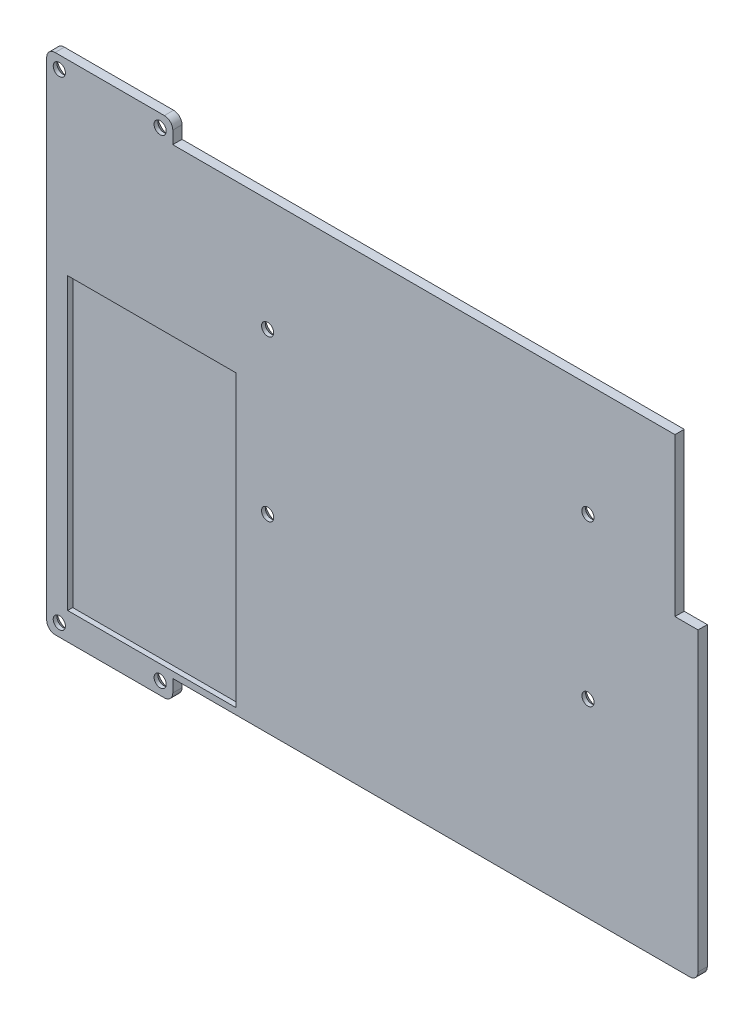
ISO-10303-21;
HEADER;
FILE_DESCRIPTION(('STEP AP214'),'2;1');
FILE_NAME('part.step','',(''),(''),'','','');
FILE_SCHEMA(('AUTOMOTIVE_DESIGN { 1 0 10303 214 1 1 1 1 }'));
ENDSEC;
DATA;
#1=APPLICATION_CONTEXT('core data for automotive mechanical design processes');
#2=APPLICATION_PROTOCOL_DEFINITION('international standard','automotive_design',2000,#1);
#3=PRODUCT_CONTEXT('',#1,'mechanical');
#4=PRODUCT('Part','Part','',(#3));
#5=PRODUCT_RELATED_PRODUCT_CATEGORY('part','',(#4));
#6=PRODUCT_DEFINITION_FORMATION('','',#4);
#7=PRODUCT_DEFINITION_CONTEXT('part definition',#1,'design');
#8=PRODUCT_DEFINITION('design','',#6,#7);
#9=PRODUCT_DEFINITION_SHAPE('','',#8);
#10=(LENGTH_UNIT() NAMED_UNIT(*) SI_UNIT(.MILLI.,.METRE.));
#11=(NAMED_UNIT(*) PLANE_ANGLE_UNIT() SI_UNIT($,.RADIAN.));
#12=(NAMED_UNIT(*) SI_UNIT($,.STERADIAN.) SOLID_ANGLE_UNIT());
#13=UNCERTAINTY_MEASURE_WITH_UNIT(LENGTH_MEASURE(1.E-05),#10,'distance_accuracy_value','');
#14=(GEOMETRIC_REPRESENTATION_CONTEXT(3) GLOBAL_UNCERTAINTY_ASSIGNED_CONTEXT((#13)) GLOBAL_UNIT_ASSIGNED_CONTEXT((#10,
#11,#12)) REPRESENTATION_CONTEXT('',''));
#15=CARTESIAN_POINT('',(0.,0.,0.));
#16=DIRECTION('',(0.,0.,1.));
#17=DIRECTION('',(1.,0.,0.));
#18=AXIS2_PLACEMENT_3D('',#15,#16,#17);
#19=CARTESIAN_POINT('',(153.,-53.,2.2));
#20=DIRECTION('',(0.,0.,1.));
#21=DIRECTION('',(1.,0.,0.));
#22=AXIS2_PLACEMENT_3D('',#19,#20,#21);
#23=PLANE('',#22);
#24=CARTESIAN_POINT('',(27.,57.,2.19999999999999));
#25=DIRECTION('',(0.,0.,-1.));
#26=DIRECTION('',(-1.,0.,0.));
#27=AXIS2_PLACEMENT_3D('',#24,#25,#26);
#28=CIRCLE('',#27,1.44999999999999);
#29=CARTESIAN_POINT('',(25.55,57.,2.19999999999999));
#30=VERTEX_POINT('',#29);
#31=EDGE_CURVE('E296',#30,#30,#28,.T.);
#32=ORIENTED_EDGE('',*,*,#31,.T.);
#33=EDGE_LOOP('',(#32));
#34=FACE_BOUND('',#33,.T.);
#35=CARTESIAN_POINT('',(3.00000000000002,57.,2.19999999999999));
#36=DIRECTION('',(0.,0.,-1.));
#37=DIRECTION('',(-1.,0.,0.));
#38=AXIS2_PLACEMENT_3D('',#35,#36,#37);
#39=CIRCLE('',#38,1.44999999999999);
#40=CARTESIAN_POINT('',(1.55000000000003,57.,2.19999999999999));
#41=VERTEX_POINT('',#40);
#42=EDGE_CURVE('E305',#41,#41,#39,.T.);
#43=ORIENTED_EDGE('',*,*,#42,.T.);
#44=EDGE_LOOP('',(#43));
#45=FACE_BOUND('',#44,.T.);
#46=CARTESIAN_POINT('',(27.,-57.,2.19999999999999));
#47=DIRECTION('',(0.,0.,-1.));
#48=DIRECTION('',(-1.,0.,0.));
#49=AXIS2_PLACEMENT_3D('',#46,#47,#48);
#50=CIRCLE('',#49,1.44999999999999);
#51=CARTESIAN_POINT('',(25.55,-57.,2.19999999999999));
#52=VERTEX_POINT('',#51);
#53=EDGE_CURVE('E314',#52,#52,#50,.T.);
#54=ORIENTED_EDGE('',*,*,#53,.T.);
#55=EDGE_LOOP('',(#54));
#56=FACE_BOUND('',#55,.T.);
#57=CARTESIAN_POINT('',(3.00000000000002,-57.,2.19999999999999));
#58=DIRECTION('',(0.,0.,-1.));
#59=DIRECTION('',(-1.,0.,0.));
#60=AXIS2_PLACEMENT_3D('',#57,#58,#59);
#61=CIRCLE('',#60,1.44999999999999);
#62=CARTESIAN_POINT('',(1.55000000000003,-57.,2.19999999999999));
#63=VERTEX_POINT('',#62);
#64=EDGE_CURVE('E323',#63,#63,#61,.T.);
#65=ORIENTED_EDGE('',*,*,#64,.T.);
#66=EDGE_LOOP('',(#65));
#67=FACE_BOUND('',#66,.T.);
#68=CARTESIAN_POINT('',(52.575,28.25,2.19999999999999));
#69=DIRECTION('',(0.,0.,-1.));
#70=DIRECTION('',(-1.,0.,0.));
#71=AXIS2_PLACEMENT_3D('',#68,#69,#70);
#72=CIRCLE('',#71,1.44999999999999);
#73=CARTESIAN_POINT('',(51.125,28.25,2.19999999999999));
#74=VERTEX_POINT('',#73);
#75=EDGE_CURVE('E332',#74,#74,#72,.T.);
#76=ORIENTED_EDGE('',*,*,#75,.T.);
#77=EDGE_LOOP('',(#76));
#78=FACE_BOUND('',#77,.T.);
#79=CARTESIAN_POINT('',(128.8,28.25,2.19999999999999));
#80=DIRECTION('',(0.,0.,-1.));
#81=DIRECTION('',(-1.,0.,0.));
#82=AXIS2_PLACEMENT_3D('',#79,#80,#81);
#83=CIRCLE('',#82,1.44999999999998);
#84=CARTESIAN_POINT('',(127.35,28.25,2.19999999999999));
#85=VERTEX_POINT('',#84);
#86=EDGE_CURVE('E341',#85,#85,#83,.T.);
#87=ORIENTED_EDGE('',*,*,#86,.T.);
#88=EDGE_LOOP('',(#87));
#89=FACE_BOUND('',#88,.T.);
#90=CARTESIAN_POINT('',(128.8,-9.84999999999998,2.19999999999999));
#91=DIRECTION('',(0.,0.,-1.));
#92=DIRECTION('',(-1.,0.,0.));
#93=AXIS2_PLACEMENT_3D('',#90,#91,#92);
#94=CIRCLE('',#93,1.44999999999998);
#95=CARTESIAN_POINT('',(127.35,-9.84999999999998,2.19999999999999));
#96=VERTEX_POINT('',#95);
#97=EDGE_CURVE('E350',#96,#96,#94,.T.);
#98=ORIENTED_EDGE('',*,*,#97,.T.);
#99=EDGE_LOOP('',(#98));
#100=FACE_BOUND('',#99,.T.);
#101=CARTESIAN_POINT('',(52.575,-9.84999999999998,2.19999999999999));
#102=DIRECTION('',(0.,0.,-1.));
#103=DIRECTION('',(-1.,0.,0.));
#104=AXIS2_PLACEMENT_3D('',#101,#102,#103);
#105=CIRCLE('',#104,1.44999999999999);
#106=CARTESIAN_POINT('',(51.125,-9.84999999999998,2.19999999999999));
#107=VERTEX_POINT('',#106);
#108=EDGE_CURVE('E196',#107,#107,#105,.T.);
#109=ORIENTED_EDGE('',*,*,#108,.T.);
#110=EDGE_LOOP('',(#109));
#111=FACE_BOUND('',#110,.T.);
#112=CARTESIAN_POINT('',(153.,-53.,2.2));
#113=DIRECTION('',(0.,0.,1.));
#114=DIRECTION('',(1.,0.,0.));
#115=AXIS2_PLACEMENT_3D('',#112,#113,#114);
#116=CIRCLE('',#115,1.99999999999999);
#117=CARTESIAN_POINT('',(153.,-55.,2.2));
#118=VERTEX_POINT('',#117);
#119=CARTESIAN_POINT('',(155.,-53.,2.2));
#120=VERTEX_POINT('',#119);
#121=EDGE_CURVE('E222',#118,#120,#116,.T.);
#122=ORIENTED_EDGE('',*,*,#121,.T.);
#123=DIRECTION('',(0.,1.,0.));
#124=VECTOR('',#123,1.);
#125=CARTESIAN_POINT('',(155.,-53.,2.2));
#126=LINE('',#125,#124);
#127=CARTESIAN_POINT('',(155.,17.5,2.2));
#128=VERTEX_POINT('',#127);
#129=EDGE_CURVE('E128',#120,#128,#126,.T.);
#130=ORIENTED_EDGE('',*,*,#129,.T.);
#131=DIRECTION('',(-1.,0.,0.));
#132=VECTOR('',#131,1.);
#133=CARTESIAN_POINT('',(149.5,17.5,2.2));
#134=LINE('',#133,#132);
#135=CARTESIAN_POINT('',(149.5,17.5,2.2));
#136=VERTEX_POINT('',#135);
#137=EDGE_CURVE('E363',#128,#136,#134,.T.);
#138=ORIENTED_EDGE('',*,*,#137,.T.);
#139=DIRECTION('',(0.,1.,0.));
#140=VECTOR('',#139,1.);
#141=CARTESIAN_POINT('',(149.5,55.,2.2));
#142=LINE('',#141,#140);
#143=CARTESIAN_POINT('',(149.5,55.,2.2));
#144=VERTEX_POINT('',#143);
#145=EDGE_CURVE('E365',#136,#144,#142,.T.);
#146=ORIENTED_EDGE('',*,*,#145,.T.);
#147=DIRECTION('',(-1.,0.,0.));
#148=VECTOR('',#147,1.);
#149=CARTESIAN_POINT('',(149.5,55.,2.2));
#150=LINE('',#149,#148);
#151=CARTESIAN_POINT('',(30.,55.,2.2));
#152=VERTEX_POINT('',#151);
#153=EDGE_CURVE('E367',#144,#152,#150,.T.);
#154=ORIENTED_EDGE('',*,*,#153,.T.);
#155=DIRECTION('',(0.,1.,0.));
#156=VECTOR('',#155,1.);
#157=CARTESIAN_POINT('',(30.,55.,2.2));
#158=LINE('',#157,#156);
#159=CARTESIAN_POINT('',(30.,58.,2.2));
#160=VERTEX_POINT('',#159);
#161=EDGE_CURVE('E369',#152,#160,#158,.T.);
#162=ORIENTED_EDGE('',*,*,#161,.T.);
#163=CARTESIAN_POINT('',(28.,58.,2.2));
#164=DIRECTION('',(0.,0.,1.));
#165=DIRECTION('',(-1.,0.,0.));
#166=AXIS2_PLACEMENT_3D('',#163,#164,#165);
#167=CIRCLE('',#166,2.);
#168=CARTESIAN_POINT('',(28.,60.,2.2));
#169=VERTEX_POINT('',#168);
#170=EDGE_CURVE('E371',#160,#169,#167,.T.);
#171=ORIENTED_EDGE('',*,*,#170,.T.);
#172=DIRECTION('',(-1.,0.,0.));
#173=VECTOR('',#172,1.);
#174=CARTESIAN_POINT('',(2.,60.,2.2));
#175=LINE('',#174,#173);
#176=CARTESIAN_POINT('',(2.,60.,2.2));
#177=VERTEX_POINT('',#176);
#178=EDGE_CURVE('E373',#169,#177,#175,.T.);
#179=ORIENTED_EDGE('',*,*,#178,.T.);
#180=CARTESIAN_POINT('',(2.,58.,2.2));
#181=DIRECTION('',(0.,0.,1.));
#182=DIRECTION('',(-1.,0.,0.));
#183=AXIS2_PLACEMENT_3D('',#180,#181,#182);
#184=CIRCLE('',#183,1.99999999999999);
#185=CARTESIAN_POINT('',(0.,58.,2.2));
#186=VERTEX_POINT('',#185);
#187=EDGE_CURVE('E375',#177,#186,#184,.T.);
#188=ORIENTED_EDGE('',*,*,#187,.T.);
#189=DIRECTION('',(0.,-1.,0.));
#190=VECTOR('',#189,1.);
#191=CARTESIAN_POINT('',(0.,-58.,2.2));
#192=LINE('',#191,#190);
#193=CARTESIAN_POINT('',(0.,-58.,2.2));
#194=VERTEX_POINT('',#193);
#195=EDGE_CURVE('E377',#186,#194,#192,.T.);
#196=ORIENTED_EDGE('',*,*,#195,.T.);
#197=CARTESIAN_POINT('',(2.,-58.,2.2));
#198=DIRECTION('',(0.,0.,1.));
#199=DIRECTION('',(-1.,0.,0.));
#200=AXIS2_PLACEMENT_3D('',#197,#198,#199);
#201=CIRCLE('',#200,2.);
#202=CARTESIAN_POINT('',(2.,-60.,2.2));
#203=VERTEX_POINT('',#202);
#204=EDGE_CURVE('E379',#194,#203,#201,.T.);
#205=ORIENTED_EDGE('',*,*,#204,.T.);
#206=DIRECTION('',(1.,0.,0.));
#207=VECTOR('',#206,1.);
#208=CARTESIAN_POINT('',(2.,-60.,2.2));
#209=LINE('',#208,#207);
#210=CARTESIAN_POINT('',(28.,-60.,2.2));
#211=VERTEX_POINT('',#210);
#212=EDGE_CURVE('E171',#203,#211,#209,.T.);
#213=ORIENTED_EDGE('',*,*,#212,.T.);
#214=CARTESIAN_POINT('',(28.,-58.,2.2));
#215=DIRECTION('',(0.,0.,1.));
#216=DIRECTION('',(1.,0.,0.));
#217=AXIS2_PLACEMENT_3D('',#214,#215,#216);
#218=CIRCLE('',#217,2.);
#219=CARTESIAN_POINT('',(30.,-58.,2.2));
#220=VERTEX_POINT('',#219);
#221=EDGE_CURVE('E164',#211,#220,#218,.T.);
#222=ORIENTED_EDGE('',*,*,#221,.T.);
#223=DIRECTION('',(0.,1.,0.));
#224=VECTOR('',#223,1.);
#225=CARTESIAN_POINT('',(30.,-55.,2.2));
#226=LINE('',#225,#224);
#227=CARTESIAN_POINT('',(30.,-55.,2.2));
#228=VERTEX_POINT('',#227);
#229=EDGE_CURVE('E168',#220,#228,#226,.T.);
#230=ORIENTED_EDGE('',*,*,#229,.T.);
#231=DIRECTION('',(1.,0.,0.));
#232=VECTOR('',#231,1.);
#233=CARTESIAN_POINT('',(153.,-55.,2.2));
#234=LINE('',#233,#232);
#235=EDGE_CURVE('E65',#228,#118,#234,.T.);
#236=ORIENTED_EDGE('',*,*,#235,.T.);
#237=EDGE_LOOP('',(#122,#130,#138,#146,#154,#162,#171,#179,#188,#196,#205,#213,#222,#230,#236));
#238=FACE_BOUND('',#237,.T.);
#239=DIRECTION('',(-1.,0.,0.));
#240=VECTOR('',#239,1.);
#241=CARTESIAN_POINT('',(153.,-53.5,2.2));
#242=LINE('',#241,#240);
#243=CARTESIAN_POINT('',(45.,-53.5,2.2));
#244=VERTEX_POINT('',#243);
#245=CARTESIAN_POINT('',(5.00000000000002,-53.5,2.2));
#246=VERTEX_POINT('',#245);
#247=EDGE_CURVE('E49',#244,#246,#242,.T.);
#248=ORIENTED_EDGE('',*,*,#247,.T.);
#249=DIRECTION('',(0.,1.,0.));
#250=VECTOR('',#249,1.);
#251=CARTESIAN_POINT('',(5.,-53.,2.2));
#252=LINE('',#251,#250);
#253=CARTESIAN_POINT('',(5.00000000000001,15.5,2.2));
#254=VERTEX_POINT('',#253);
#255=EDGE_CURVE('E11',#246,#254,#252,.T.);
#256=ORIENTED_EDGE('',*,*,#255,.T.);
#257=DIRECTION('',(1.,0.,0.));
#258=VECTOR('',#257,1.);
#259=CARTESIAN_POINT('',(153.,15.5,2.2));
#260=LINE('',#259,#258);
#261=CARTESIAN_POINT('',(45.,15.5,2.2));
#262=VERTEX_POINT('',#261);
#263=EDGE_CURVE('E258',#254,#262,#260,.T.);
#264=ORIENTED_EDGE('',*,*,#263,.T.);
#265=DIRECTION('',(0.,-1.,0.));
#266=VECTOR('',#265,1.);
#267=CARTESIAN_POINT('',(45.,-53.,2.2));
#268=LINE('',#267,#266);
#269=EDGE_CURVE('E261',#262,#244,#268,.T.);
#270=ORIENTED_EDGE('',*,*,#269,.T.);
#271=EDGE_LOOP('',(#248,#256,#264,#270));
#272=FACE_BOUND('',#271,.T.);
#273=ADVANCED_FACE('F41',(#34,#45,#56,#67,#78,#89,#100,#111,#238,#272),#23,.T.);
#274=CARTESIAN_POINT('',(153.,-53.,0.));
#275=DIRECTION('',(0.,0.,1.));
#276=DIRECTION('',(1.,0.,0.));
#277=AXIS2_PLACEMENT_3D('',#274,#275,#276);
#278=PLANE('',#277);
#279=CARTESIAN_POINT('',(27.,57.,0.));
#280=DIRECTION('',(0.,0.,-1.));
#281=DIRECTION('',(-1.,0.,0.));
#282=AXIS2_PLACEMENT_3D('',#279,#280,#281);
#283=CIRCLE('',#282,2.75);
#284=CARTESIAN_POINT('',(24.25,57.,0.));
#285=VERTEX_POINT('',#284);
#286=EDGE_CURVE('E285',#285,#285,#283,.T.);
#287=ORIENTED_EDGE('',*,*,#286,.F.);
#288=EDGE_LOOP('',(#287));
#289=FACE_BOUND('',#288,.T.);
#290=CARTESIAN_POINT('',(3.00000000000002,57.,0.));
#291=DIRECTION('',(0.,0.,-1.));
#292=DIRECTION('',(-1.,0.,0.));
#293=AXIS2_PLACEMENT_3D('',#290,#291,#292);
#294=CIRCLE('',#293,2.75);
#295=CARTESIAN_POINT('',(0.250000000000018,57.,0.));
#296=VERTEX_POINT('',#295);
#297=EDGE_CURVE('E299',#296,#296,#294,.T.);
#298=ORIENTED_EDGE('',*,*,#297,.F.);
#299=EDGE_LOOP('',(#298));
#300=FACE_BOUND('',#299,.T.);
#301=CARTESIAN_POINT('',(3.00000000000002,-57.,0.));
#302=DIRECTION('',(0.,0.,-1.));
#303=DIRECTION('',(-1.,0.,0.));
#304=AXIS2_PLACEMENT_3D('',#301,#302,#303);
#305=CIRCLE('',#304,2.75);
#306=CARTESIAN_POINT('',(0.250000000000018,-57.,0.));
#307=VERTEX_POINT('',#306);
#308=EDGE_CURVE('E317',#307,#307,#305,.T.);
#309=ORIENTED_EDGE('',*,*,#308,.F.);
#310=EDGE_LOOP('',(#309));
#311=FACE_BOUND('',#310,.T.);
#312=CARTESIAN_POINT('',(52.575,28.25,0.));
#313=DIRECTION('',(0.,0.,-1.));
#314=DIRECTION('',(-1.,0.,0.));
#315=AXIS2_PLACEMENT_3D('',#312,#313,#314);
#316=CIRCLE('',#315,2.75);
#317=CARTESIAN_POINT('',(49.825,28.25,0.));
#318=VERTEX_POINT('',#317);
#319=EDGE_CURVE('E326',#318,#318,#316,.T.);
#320=ORIENTED_EDGE('',*,*,#319,.F.);
#321=EDGE_LOOP('',(#320));
#322=FACE_BOUND('',#321,.T.);
#323=CARTESIAN_POINT('',(128.8,28.25,0.));
#324=DIRECTION('',(0.,0.,-1.));
#325=DIRECTION('',(-1.,0.,0.));
#326=AXIS2_PLACEMENT_3D('',#323,#324,#325);
#327=CIRCLE('',#326,2.75);
#328=CARTESIAN_POINT('',(126.05,28.25,0.));
#329=VERTEX_POINT('',#328);
#330=EDGE_CURVE('E335',#329,#329,#327,.T.);
#331=ORIENTED_EDGE('',*,*,#330,.F.);
#332=EDGE_LOOP('',(#331));
#333=FACE_BOUND('',#332,.T.);
#334=CARTESIAN_POINT('',(128.8,-9.84999999999998,0.));
#335=DIRECTION('',(0.,0.,-1.));
#336=DIRECTION('',(-1.,0.,0.));
#337=AXIS2_PLACEMENT_3D('',#334,#335,#336);
#338=CIRCLE('',#337,2.75);
#339=CARTESIAN_POINT('',(126.05,-9.84999999999998,0.));
#340=VERTEX_POINT('',#339);
#341=EDGE_CURVE('E344',#340,#340,#338,.T.);
#342=ORIENTED_EDGE('',*,*,#341,.F.);
#343=EDGE_LOOP('',(#342));
#344=FACE_BOUND('',#343,.T.);
#345=CARTESIAN_POINT('',(52.575,-9.84999999999998,0.));
#346=DIRECTION('',(0.,0.,-1.));
#347=DIRECTION('',(-1.,0.,0.));
#348=AXIS2_PLACEMENT_3D('',#345,#346,#347);
#349=CIRCLE('',#348,2.75);
#350=CARTESIAN_POINT('',(49.825,-9.84999999999998,0.));
#351=VERTEX_POINT('',#350);
#352=EDGE_CURVE('E353',#351,#351,#349,.T.);
#353=ORIENTED_EDGE('',*,*,#352,.F.);
#354=EDGE_LOOP('',(#353));
#355=FACE_BOUND('',#354,.T.);
#356=CARTESIAN_POINT('',(153.,-53.,0.));
#357=DIRECTION('',(0.,0.,1.));
#358=DIRECTION('',(1.,0.,0.));
#359=AXIS2_PLACEMENT_3D('',#356,#357,#358);
#360=CIRCLE('',#359,1.99999999999999);
#361=CARTESIAN_POINT('',(153.,-55.,0.));
#362=VERTEX_POINT('',#361);
#363=CARTESIAN_POINT('',(155.,-53.,0.));
#364=VERTEX_POINT('',#363);
#365=EDGE_CURVE('E192',#362,#364,#360,.T.);
#366=ORIENTED_EDGE('',*,*,#365,.F.);
#367=DIRECTION('',(1.,0.,0.));
#368=VECTOR('',#367,1.);
#369=CARTESIAN_POINT('',(153.,-55.,0.));
#370=LINE('',#369,#368);
#371=CARTESIAN_POINT('',(30.,-55.,0.));
#372=VERTEX_POINT('',#371);
#373=EDGE_CURVE('E119',#372,#362,#370,.T.);
#374=ORIENTED_EDGE('',*,*,#373,.F.);
#375=DIRECTION('',(0.,1.,0.));
#376=VECTOR('',#375,1.);
#377=CARTESIAN_POINT('',(30.,-55.,0.));
#378=LINE('',#377,#376);
#379=CARTESIAN_POINT('',(30.,-58.,0.));
#380=VERTEX_POINT('',#379);
#381=EDGE_CURVE('E219',#380,#372,#378,.T.);
#382=ORIENTED_EDGE('',*,*,#381,.F.);
#383=CARTESIAN_POINT('',(28.,-58.,0.));
#384=DIRECTION('',(0.,0.,1.));
#385=DIRECTION('',(1.,0.,0.));
#386=AXIS2_PLACEMENT_3D('',#383,#384,#385);
#387=CIRCLE('',#386,2.);
#388=CARTESIAN_POINT('',(28.,-60.,0.));
#389=VERTEX_POINT('',#388);
#390=EDGE_CURVE('E180',#389,#380,#387,.T.);
#391=ORIENTED_EDGE('',*,*,#390,.F.);
#392=DIRECTION('',(1.,0.,0.));
#393=VECTOR('',#392,1.);
#394=CARTESIAN_POINT('',(2.,-60.,0.));
#395=LINE('',#394,#393);
#396=CARTESIAN_POINT('',(2.,-60.,0.));
#397=VERTEX_POINT('',#396);
#398=EDGE_CURVE('E216',#397,#389,#395,.T.);
#399=ORIENTED_EDGE('',*,*,#398,.F.);
#400=CARTESIAN_POINT('',(2.,-58.,0.));
#401=DIRECTION('',(0.,0.,1.));
#402=DIRECTION('',(-1.,0.,0.));
#403=AXIS2_PLACEMENT_3D('',#400,#401,#402);
#404=CIRCLE('',#403,2.);
#405=CARTESIAN_POINT('',(0.,-58.,0.));
#406=VERTEX_POINT('',#405);
#407=EDGE_CURVE('E214',#406,#397,#404,.T.);
#408=ORIENTED_EDGE('',*,*,#407,.F.);
#409=DIRECTION('',(0.,-1.,0.));
#410=VECTOR('',#409,1.);
#411=CARTESIAN_POINT('',(0.,-58.,0.));
#412=LINE('',#411,#410);
#413=CARTESIAN_POINT('',(0.,58.,0.));
#414=VERTEX_POINT('',#413);
#415=EDGE_CURVE('E212',#414,#406,#412,.T.);
#416=ORIENTED_EDGE('',*,*,#415,.F.);
#417=CARTESIAN_POINT('',(2.,58.,0.));
#418=DIRECTION('',(0.,0.,1.));
#419=DIRECTION('',(-1.,0.,0.));
#420=AXIS2_PLACEMENT_3D('',#417,#418,#419);
#421=CIRCLE('',#420,1.99999999999999);
#422=CARTESIAN_POINT('',(2.,60.,0.));
#423=VERTEX_POINT('',#422);
#424=EDGE_CURVE('E210',#423,#414,#421,.T.);
#425=ORIENTED_EDGE('',*,*,#424,.F.);
#426=DIRECTION('',(-1.,0.,0.));
#427=VECTOR('',#426,1.);
#428=CARTESIAN_POINT('',(2.,60.,0.));
#429=LINE('',#428,#427);
#430=CARTESIAN_POINT('',(28.,60.,0.));
#431=VERTEX_POINT('',#430);
#432=EDGE_CURVE('E208',#431,#423,#429,.T.);
#433=ORIENTED_EDGE('',*,*,#432,.F.);
#434=CARTESIAN_POINT('',(28.,58.,0.));
#435=DIRECTION('',(0.,0.,1.));
#436=DIRECTION('',(-1.,0.,0.));
#437=AXIS2_PLACEMENT_3D('',#434,#435,#436);
#438=CIRCLE('',#437,2.);
#439=CARTESIAN_POINT('',(30.,58.,0.));
#440=VERTEX_POINT('',#439);
#441=EDGE_CURVE('E206',#440,#431,#438,.T.);
#442=ORIENTED_EDGE('',*,*,#441,.F.);
#443=DIRECTION('',(0.,1.,0.));
#444=VECTOR('',#443,1.);
#445=CARTESIAN_POINT('',(30.,55.,0.));
#446=LINE('',#445,#444);
#447=CARTESIAN_POINT('',(30.,55.,0.));
#448=VERTEX_POINT('',#447);
#449=EDGE_CURVE('E204',#448,#440,#446,.T.);
#450=ORIENTED_EDGE('',*,*,#449,.F.);
#451=DIRECTION('',(-1.,0.,0.));
#452=VECTOR('',#451,1.);
#453=CARTESIAN_POINT('',(149.5,55.,0.));
#454=LINE('',#453,#452);
#455=CARTESIAN_POINT('',(149.5,55.,0.));
#456=VERTEX_POINT('',#455);
#457=EDGE_CURVE('E202',#456,#448,#454,.T.);
#458=ORIENTED_EDGE('',*,*,#457,.F.);
#459=DIRECTION('',(0.,1.,0.));
#460=VECTOR('',#459,1.);
#461=CARTESIAN_POINT('',(149.5,55.,0.));
#462=LINE('',#461,#460);
#463=CARTESIAN_POINT('',(149.5,17.5,0.));
#464=VERTEX_POINT('',#463);
#465=EDGE_CURVE('E200',#464,#456,#462,.T.);
#466=ORIENTED_EDGE('',*,*,#465,.F.);
#467=DIRECTION('',(-1.,0.,0.));
#468=VECTOR('',#467,1.);
#469=CARTESIAN_POINT('',(149.5,17.5,0.));
#470=LINE('',#469,#468);
#471=CARTESIAN_POINT('',(155.,17.5,0.));
#472=VERTEX_POINT('',#471);
#473=EDGE_CURVE('E198',#472,#464,#470,.T.);
#474=ORIENTED_EDGE('',*,*,#473,.F.);
#475=DIRECTION('',(0.,1.,0.));
#476=VECTOR('',#475,1.);
#477=CARTESIAN_POINT('',(155.,-53.,0.));
#478=LINE('',#477,#476);
#479=EDGE_CURVE('E195',#364,#472,#478,.T.);
#480=ORIENTED_EDGE('',*,*,#479,.F.);
#481=EDGE_LOOP('',(#366,#374,#382,#391,#399,#408,#416,#425,#433,#442,#450,#458,#466,#474,#480));
#482=FACE_BOUND('',#481,.T.);
#483=CARTESIAN_POINT('',(27.,-57.,0.));
#484=DIRECTION('',(0.,0.,-1.));
#485=DIRECTION('',(-1.,0.,0.));
#486=AXIS2_PLACEMENT_3D('',#483,#484,#485);
#487=CIRCLE('',#486,2.75);
#488=CARTESIAN_POINT('',(24.25,-57.,0.));
#489=VERTEX_POINT('',#488);
#490=EDGE_CURVE('E308',#489,#489,#487,.T.);
#491=ORIENTED_EDGE('',*,*,#490,.F.);
#492=EDGE_LOOP('',(#491));
#493=FACE_BOUND('',#492,.T.);
#494=ADVANCED_FACE('F392',(#289,#300,#311,#322,#333,#344,#355,#482,#493),#278,.F.);
#495=CARTESIAN_POINT('',(153.,-53.,2.2));
#496=DIRECTION('',(0.,0.,-1.));
#497=DIRECTION('',(-1.,0.,0.));
#498=AXIS2_PLACEMENT_3D('',#495,#496,#497);
#499=CYLINDRICAL_SURFACE('',#498,1.99999999999999);
#500=ORIENTED_EDGE('',*,*,#365,.T.);
#501=DIRECTION('',(0.,0.,-1.));
#502=VECTOR('',#501,1.);
#503=CARTESIAN_POINT('',(155.,-53.,2.2));
#504=LINE('',#503,#502);
#505=EDGE_CURVE('E256',#120,#364,#504,.T.);
#506=ORIENTED_EDGE('',*,*,#505,.F.);
#507=ORIENTED_EDGE('',*,*,#121,.F.);
#508=DIRECTION('',(0.,0.,-1.));
#509=VECTOR('',#508,1.);
#510=CARTESIAN_POINT('',(153.,-55.,2.2));
#511=LINE('',#510,#509);
#512=EDGE_CURVE('E188',#118,#362,#511,.T.);
#513=ORIENTED_EDGE('',*,*,#512,.T.);
#514=EDGE_LOOP('',(#500,#506,#507,#513));
#515=FACE_BOUND('',#514,.T.);
#516=ADVANCED_FACE('F43',(#515),#499,.T.);
#517=CARTESIAN_POINT('',(155.,-53.,2.2));
#518=DIRECTION('',(-1.,0.,0.));
#519=DIRECTION('',(0.,-1.,0.));
#520=AXIS2_PLACEMENT_3D('',#517,#518,#519);
#521=PLANE('',#520);
#522=ORIENTED_EDGE('',*,*,#479,.T.);
#523=DIRECTION('',(0.,0.,-1.));
#524=VECTOR('',#523,1.);
#525=CARTESIAN_POINT('',(155.,17.5,2.2));
#526=LINE('',#525,#524);
#527=EDGE_CURVE('E253',#128,#472,#526,.T.);
#528=ORIENTED_EDGE('',*,*,#527,.F.);
#529=ORIENTED_EDGE('',*,*,#129,.F.);
#530=ORIENTED_EDGE('',*,*,#505,.T.);
#531=EDGE_LOOP('',(#522,#528,#529,#530));
#532=FACE_BOUND('',#531,.T.);
#533=ADVANCED_FACE('F400',(#532),#521,.F.);
#534=CARTESIAN_POINT('',(149.5,17.5,2.2));
#535=DIRECTION('',(0.,-1.,0.));
#536=DIRECTION('',(0.,0.,-1.));
#537=AXIS2_PLACEMENT_3D('',#534,#535,#536);
#538=PLANE('',#537);
#539=ORIENTED_EDGE('',*,*,#473,.T.);
#540=DIRECTION('',(0.,0.,-1.));
#541=VECTOR('',#540,1.);
#542=CARTESIAN_POINT('',(149.5,17.5,2.2));
#543=LINE('',#542,#541);
#544=EDGE_CURVE('E250',#136,#464,#543,.T.);
#545=ORIENTED_EDGE('',*,*,#544,.F.);
#546=ORIENTED_EDGE('',*,*,#137,.F.);
#547=ORIENTED_EDGE('',*,*,#527,.T.);
#548=EDGE_LOOP('',(#539,#545,#546,#547));
#549=FACE_BOUND('',#548,.T.);
#550=ADVANCED_FACE('F403',(#549),#538,.F.);
#551=CARTESIAN_POINT('',(149.5,55.,2.2));
#552=DIRECTION('',(-1.,0.,0.));
#553=DIRECTION('',(0.,0.,1.));
#554=AXIS2_PLACEMENT_3D('',#551,#552,#553);
#555=PLANE('',#554);
#556=ORIENTED_EDGE('',*,*,#465,.T.);
#557=DIRECTION('',(0.,0.,-1.));
#558=VECTOR('',#557,1.);
#559=CARTESIAN_POINT('',(149.5,55.,2.2));
#560=LINE('',#559,#558);
#561=EDGE_CURVE('E247',#144,#456,#560,.T.);
#562=ORIENTED_EDGE('',*,*,#561,.F.);
#563=ORIENTED_EDGE('',*,*,#145,.F.);
#564=ORIENTED_EDGE('',*,*,#544,.T.);
#565=EDGE_LOOP('',(#556,#562,#563,#564));
#566=FACE_BOUND('',#565,.T.);
#567=ADVANCED_FACE('F408',(#566),#555,.F.);
#568=CARTESIAN_POINT('',(149.5,55.,2.2));
#569=DIRECTION('',(0.,-1.,0.));
#570=DIRECTION('',(1.,0.,0.));
#571=AXIS2_PLACEMENT_3D('',#568,#569,#570);
#572=PLANE('',#571);
#573=ORIENTED_EDGE('',*,*,#457,.T.);
#574=DIRECTION('',(0.,0.,-1.));
#575=VECTOR('',#574,1.);
#576=CARTESIAN_POINT('',(30.,55.,2.2));
#577=LINE('',#576,#575);
#578=EDGE_CURVE('E244',#152,#448,#577,.T.);
#579=ORIENTED_EDGE('',*,*,#578,.F.);
#580=ORIENTED_EDGE('',*,*,#153,.F.);
#581=ORIENTED_EDGE('',*,*,#561,.T.);
#582=EDGE_LOOP('',(#573,#579,#580,#581));
#583=FACE_BOUND('',#582,.T.);
#584=ADVANCED_FACE('F414',(#583),#572,.F.);
#585=CARTESIAN_POINT('',(30.,55.,2.2));
#586=DIRECTION('',(-1.,0.,0.));
#587=DIRECTION('',(0.,0.,1.));
#588=AXIS2_PLACEMENT_3D('',#585,#586,#587);
#589=PLANE('',#588);
#590=ORIENTED_EDGE('',*,*,#449,.T.);
#591=DIRECTION('',(0.,0.,-1.));
#592=VECTOR('',#591,1.);
#593=CARTESIAN_POINT('',(30.,58.,2.2));
#594=LINE('',#593,#592);
#595=EDGE_CURVE('E241',#160,#440,#594,.T.);
#596=ORIENTED_EDGE('',*,*,#595,.F.);
#597=ORIENTED_EDGE('',*,*,#161,.F.);
#598=ORIENTED_EDGE('',*,*,#578,.T.);
#599=EDGE_LOOP('',(#590,#596,#597,#598));
#600=FACE_BOUND('',#599,.T.);
#601=ADVANCED_FACE('F418',(#600),#589,.F.);
#602=CARTESIAN_POINT('',(28.,58.,2.2));
#603=DIRECTION('',(0.,0.,-1.));
#604=DIRECTION('',(-1.,0.,0.));
#605=AXIS2_PLACEMENT_3D('',#602,#603,#604);
#606=CYLINDRICAL_SURFACE('',#605,2.);
#607=ORIENTED_EDGE('',*,*,#441,.T.);
#608=DIRECTION('',(0.,0.,-1.));
#609=VECTOR('',#608,1.);
#610=CARTESIAN_POINT('',(28.,60.,2.2));
#611=LINE('',#610,#609);
#612=EDGE_CURVE('E238',#169,#431,#611,.T.);
#613=ORIENTED_EDGE('',*,*,#612,.F.);
#614=ORIENTED_EDGE('',*,*,#170,.F.);
#615=ORIENTED_EDGE('',*,*,#595,.T.);
#616=EDGE_LOOP('',(#607,#613,#614,#615));
#617=FACE_BOUND('',#616,.T.);
#618=ADVANCED_FACE('F423',(#617),#606,.T.);
#619=CARTESIAN_POINT('',(2.,60.,2.2));
#620=DIRECTION('',(0.,-1.,0.));
#621=DIRECTION('',(1.,0.,0.));
#622=AXIS2_PLACEMENT_3D('',#619,#620,#621);
#623=PLANE('',#622);
#624=ORIENTED_EDGE('',*,*,#432,.T.);
#625=DIRECTION('',(0.,0.,-1.));
#626=VECTOR('',#625,1.);
#627=CARTESIAN_POINT('',(2.,60.,2.2));
#628=LINE('',#627,#626);
#629=EDGE_CURVE('E235',#177,#423,#628,.T.);
#630=ORIENTED_EDGE('',*,*,#629,.F.);
#631=ORIENTED_EDGE('',*,*,#178,.F.);
#632=ORIENTED_EDGE('',*,*,#612,.T.);
#633=EDGE_LOOP('',(#624,#630,#631,#632));
#634=FACE_BOUND('',#633,.T.);
#635=ADVANCED_FACE('F429',(#634),#623,.F.);
#636=CARTESIAN_POINT('',(2.,58.,2.2));
#637=DIRECTION('',(0.,0.,-1.));
#638=DIRECTION('',(-1.,0.,0.));
#639=AXIS2_PLACEMENT_3D('',#636,#637,#638);
#640=CYLINDRICAL_SURFACE('',#639,1.99999999999999);
#641=ORIENTED_EDGE('',*,*,#424,.T.);
#642=DIRECTION('',(0.,0.,-1.));
#643=VECTOR('',#642,1.);
#644=CARTESIAN_POINT('',(0.,58.,2.2));
#645=LINE('',#644,#643);
#646=EDGE_CURVE('E232',#186,#414,#645,.T.);
#647=ORIENTED_EDGE('',*,*,#646,.F.);
#648=ORIENTED_EDGE('',*,*,#187,.F.);
#649=ORIENTED_EDGE('',*,*,#629,.T.);
#650=EDGE_LOOP('',(#641,#647,#648,#649));
#651=FACE_BOUND('',#650,.T.);
#652=ADVANCED_FACE('F433',(#651),#640,.T.);
#653=CARTESIAN_POINT('',(0.,-58.,2.2));
#654=DIRECTION('',(1.,0.,0.));
#655=DIRECTION('',(0.,1.,0.));
#656=AXIS2_PLACEMENT_3D('',#653,#654,#655);
#657=PLANE('',#656);
#658=ORIENTED_EDGE('',*,*,#415,.T.);
#659=DIRECTION('',(0.,0.,-1.));
#660=VECTOR('',#659,1.);
#661=CARTESIAN_POINT('',(0.,-58.,2.2));
#662=LINE('',#661,#660);
#663=EDGE_CURVE('E229',#194,#406,#662,.T.);
#664=ORIENTED_EDGE('',*,*,#663,.F.);
#665=ORIENTED_EDGE('',*,*,#195,.F.);
#666=ORIENTED_EDGE('',*,*,#646,.T.);
#667=EDGE_LOOP('',(#658,#664,#665,#666));
#668=FACE_BOUND('',#667,.T.);
#669=ADVANCED_FACE('F436',(#668),#657,.F.);
#670=CARTESIAN_POINT('',(2.,-58.,2.2));
#671=DIRECTION('',(0.,0.,-1.));
#672=DIRECTION('',(-1.,0.,0.));
#673=AXIS2_PLACEMENT_3D('',#670,#671,#672);
#674=CYLINDRICAL_SURFACE('',#673,2.);
#675=ORIENTED_EDGE('',*,*,#407,.T.);
#676=DIRECTION('',(0.,0.,-1.));
#677=VECTOR('',#676,1.);
#678=CARTESIAN_POINT('',(2.,-60.,2.2));
#679=LINE('',#678,#677);
#680=EDGE_CURVE('E226',#203,#397,#679,.T.);
#681=ORIENTED_EDGE('',*,*,#680,.F.);
#682=ORIENTED_EDGE('',*,*,#204,.F.);
#683=ORIENTED_EDGE('',*,*,#663,.T.);
#684=EDGE_LOOP('',(#675,#681,#682,#683));
#685=FACE_BOUND('',#684,.T.);
#686=ADVANCED_FACE('F385',(#685),#674,.T.);
#687=CARTESIAN_POINT('',(2.,-60.,2.2));
#688=DIRECTION('',(0.,1.,0.));
#689=DIRECTION('',(0.,0.,1.));
#690=AXIS2_PLACEMENT_3D('',#687,#688,#689);
#691=PLANE('',#690);
#692=ORIENTED_EDGE('',*,*,#398,.T.);
#693=DIRECTION('',(0.,0.,-1.));
#694=VECTOR('',#693,1.);
#695=CARTESIAN_POINT('',(28.,-60.,2.2));
#696=LINE('',#695,#694);
#697=EDGE_CURVE('E183',#211,#389,#696,.T.);
#698=ORIENTED_EDGE('',*,*,#697,.F.);
#699=ORIENTED_EDGE('',*,*,#212,.F.);
#700=ORIENTED_EDGE('',*,*,#680,.T.);
#701=EDGE_LOOP('',(#692,#698,#699,#700));
#702=FACE_BOUND('',#701,.T.);
#703=ADVANCED_FACE('F389',(#702),#691,.F.);
#704=CARTESIAN_POINT('',(28.,-58.,2.2));
#705=DIRECTION('',(0.,0.,-1.));
#706=DIRECTION('',(-1.,0.,0.));
#707=AXIS2_PLACEMENT_3D('',#704,#705,#706);
#708=CYLINDRICAL_SURFACE('',#707,2.);
#709=ORIENTED_EDGE('',*,*,#390,.T.);
#710=DIRECTION('',(0.,0.,-1.));
#711=VECTOR('',#710,1.);
#712=CARTESIAN_POINT('',(30.,-58.,2.2));
#713=LINE('',#712,#711);
#714=EDGE_CURVE('E177',#220,#380,#713,.T.);
#715=ORIENTED_EDGE('',*,*,#714,.F.);
#716=ORIENTED_EDGE('',*,*,#221,.F.);
#717=ORIENTED_EDGE('',*,*,#697,.T.);
#718=EDGE_LOOP('',(#709,#715,#716,#717));
#719=FACE_BOUND('',#718,.T.);
#720=ADVANCED_FACE('F178',(#719),#708,.T.);
#721=CARTESIAN_POINT('',(30.,-55.,2.2));
#722=DIRECTION('',(-1.,0.,0.));
#723=DIRECTION('',(0.,0.,1.));
#724=AXIS2_PLACEMENT_3D('',#721,#722,#723);
#725=PLANE('',#724);
#726=ORIENTED_EDGE('',*,*,#381,.T.);
#727=DIRECTION('',(0.,0.,-1.));
#728=VECTOR('',#727,1.);
#729=CARTESIAN_POINT('',(30.,-55.,2.2));
#730=LINE('',#729,#728);
#731=EDGE_CURVE('E184',#228,#372,#730,.T.);
#732=ORIENTED_EDGE('',*,*,#731,.F.);
#733=ORIENTED_EDGE('',*,*,#229,.F.);
#734=ORIENTED_EDGE('',*,*,#714,.T.);
#735=EDGE_LOOP('',(#726,#732,#733,#734));
#736=FACE_BOUND('',#735,.T.);
#737=ADVANCED_FACE('F186',(#736),#725,.F.);
#738=CARTESIAN_POINT('',(153.,-55.,2.2));
#739=DIRECTION('',(0.,1.,0.));
#740=DIRECTION('',(-1.,0.,0.));
#741=AXIS2_PLACEMENT_3D('',#738,#739,#740);
#742=PLANE('',#741);
#743=ORIENTED_EDGE('',*,*,#373,.T.);
#744=ORIENTED_EDGE('',*,*,#512,.F.);
#745=ORIENTED_EDGE('',*,*,#235,.F.);
#746=ORIENTED_EDGE('',*,*,#731,.T.);
#747=EDGE_LOOP('',(#743,#744,#745,#746));
#748=FACE_BOUND('',#747,.T.);
#749=ADVANCED_FACE('F394',(#748),#742,.F.);
#750=CARTESIAN_POINT('',(52.575,-9.84999999999998,0.));
#751=DIRECTION('',(0.,0.,-1.));
#752=DIRECTION('',(-1.,0.,0.));
#753=AXIS2_PLACEMENT_3D('',#750,#751,#752);
#754=CYLINDRICAL_SURFACE('',#753,1.44999999999999);
#755=ORIENTED_EDGE('',*,*,#108,.F.);
#756=EDGE_LOOP('',(#755));
#757=FACE_BOUND('',#756,.T.);
#758=CARTESIAN_POINT('',(52.575,-9.84999999999998,1.3));
#759=DIRECTION('',(0.,0.,-1.));
#760=DIRECTION('',(-1.,0.,0.));
#761=AXIS2_PLACEMENT_3D('',#758,#759,#760);
#762=CIRCLE('',#761,1.45);
#763=CARTESIAN_POINT('',(51.125,-9.84999999999998,1.3));
#764=VERTEX_POINT('',#763);
#765=EDGE_CURVE('E356',#764,#764,#762,.T.);
#766=ORIENTED_EDGE('',*,*,#765,.T.);
#767=EDGE_LOOP('',(#766));
#768=FACE_BOUND('',#767,.T.);
#769=ADVANCED_FACE('F457',(#757,#768),#754,.F.);
#770=CARTESIAN_POINT('',(52.575,-9.84999999999998,0.));
#771=DIRECTION('',(0.,0.,-1.));
#772=DIRECTION('',(-1.,0.,0.));
#773=AXIS2_PLACEMENT_3D('',#770,#771,#772);
#774=CONICAL_SURFACE('',#773,2.75,0.785398163397449);
#775=ORIENTED_EDGE('',*,*,#765,.F.);
#776=EDGE_LOOP('',(#775));
#777=FACE_BOUND('',#776,.T.);
#778=ORIENTED_EDGE('',*,*,#352,.T.);
#779=EDGE_LOOP('',(#778));
#780=FACE_BOUND('',#779,.T.);
#781=ADVANCED_FACE('F493',(#777,#780),#774,.F.);
#782=CARTESIAN_POINT('',(128.8,-9.84999999999998,0.));
#783=DIRECTION('',(0.,0.,-1.));
#784=DIRECTION('',(-1.,0.,0.));
#785=AXIS2_PLACEMENT_3D('',#782,#783,#784);
#786=CYLINDRICAL_SURFACE('',#785,1.44999999999999);
#787=ORIENTED_EDGE('',*,*,#97,.F.);
#788=EDGE_LOOP('',(#787));
#789=FACE_BOUND('',#788,.T.);
#790=CARTESIAN_POINT('',(128.8,-9.84999999999998,1.3));
#791=DIRECTION('',(0.,0.,-1.));
#792=DIRECTION('',(-1.,0.,0.));
#793=AXIS2_PLACEMENT_3D('',#790,#791,#792);
#794=CIRCLE('',#793,1.45000000000001);
#795=CARTESIAN_POINT('',(127.35,-9.84999999999998,1.3));
#796=VERTEX_POINT('',#795);
#797=EDGE_CURVE('E347',#796,#796,#794,.T.);
#798=ORIENTED_EDGE('',*,*,#797,.T.);
#799=EDGE_LOOP('',(#798));
#800=FACE_BOUND('',#799,.T.);
#801=ADVANCED_FACE('F501',(#789,#800),#786,.F.);
#802=CARTESIAN_POINT('',(128.8,-9.84999999999998,0.));
#803=DIRECTION('',(0.,0.,-1.));
#804=DIRECTION('',(-1.,0.,0.));
#805=AXIS2_PLACEMENT_3D('',#802,#803,#804);
#806=CONICAL_SURFACE('',#805,2.75,0.785398163397446);
#807=ORIENTED_EDGE('',*,*,#797,.F.);
#808=EDGE_LOOP('',(#807));
#809=FACE_BOUND('',#808,.T.);
#810=ORIENTED_EDGE('',*,*,#341,.T.);
#811=EDGE_LOOP('',(#810));
#812=FACE_BOUND('',#811,.T.);
#813=ADVANCED_FACE('F509',(#809,#812),#806,.F.);
#814=CARTESIAN_POINT('',(128.8,28.25,0.));
#815=DIRECTION('',(0.,0.,-1.));
#816=DIRECTION('',(-1.,0.,0.));
#817=AXIS2_PLACEMENT_3D('',#814,#815,#816);
#818=CYLINDRICAL_SURFACE('',#817,1.44999999999999);
#819=ORIENTED_EDGE('',*,*,#86,.F.);
#820=EDGE_LOOP('',(#819));
#821=FACE_BOUND('',#820,.T.);
#822=CARTESIAN_POINT('',(128.8,28.25,1.3));
#823=DIRECTION('',(0.,0.,-1.));
#824=DIRECTION('',(-1.,0.,0.));
#825=AXIS2_PLACEMENT_3D('',#822,#823,#824);
#826=CIRCLE('',#825,1.45000000000001);
#827=CARTESIAN_POINT('',(127.35,28.25,1.3));
#828=VERTEX_POINT('',#827);
#829=EDGE_CURVE('E338',#828,#828,#826,.T.);
#830=ORIENTED_EDGE('',*,*,#829,.T.);
#831=EDGE_LOOP('',(#830));
#832=FACE_BOUND('',#831,.T.);
#833=ADVANCED_FACE('F518',(#821,#832),#818,.F.);
#834=CARTESIAN_POINT('',(128.8,28.25,0.));
#835=DIRECTION('',(0.,0.,-1.));
#836=DIRECTION('',(-1.,0.,0.));
#837=AXIS2_PLACEMENT_3D('',#834,#835,#836);
#838=CONICAL_SURFACE('',#837,2.75,0.785398163397446);
#839=ORIENTED_EDGE('',*,*,#829,.F.);
#840=EDGE_LOOP('',(#839));
#841=FACE_BOUND('',#840,.T.);
#842=ORIENTED_EDGE('',*,*,#330,.T.);
#843=EDGE_LOOP('',(#842));
#844=FACE_BOUND('',#843,.T.);
#845=ADVANCED_FACE('F527',(#841,#844),#838,.F.);
#846=CARTESIAN_POINT('',(52.575,28.25,0.));
#847=DIRECTION('',(0.,0.,-1.));
#848=DIRECTION('',(-1.,0.,0.));
#849=AXIS2_PLACEMENT_3D('',#846,#847,#848);
#850=CYLINDRICAL_SURFACE('',#849,1.44999999999999);
#851=ORIENTED_EDGE('',*,*,#75,.F.);
#852=EDGE_LOOP('',(#851));
#853=FACE_BOUND('',#852,.T.);
#854=CARTESIAN_POINT('',(52.575,28.25,1.3));
#855=DIRECTION('',(0.,0.,-1.));
#856=DIRECTION('',(-1.,0.,0.));
#857=AXIS2_PLACEMENT_3D('',#854,#855,#856);
#858=CIRCLE('',#857,1.45);
#859=CARTESIAN_POINT('',(51.125,28.25,1.3));
#860=VERTEX_POINT('',#859);
#861=EDGE_CURVE('E329',#860,#860,#858,.T.);
#862=ORIENTED_EDGE('',*,*,#861,.T.);
#863=EDGE_LOOP('',(#862));
#864=FACE_BOUND('',#863,.T.);
#865=ADVANCED_FACE('F536',(#853,#864),#850,.F.);
#866=CARTESIAN_POINT('',(52.575,28.25,0.));
#867=DIRECTION('',(0.,0.,-1.));
#868=DIRECTION('',(-1.,0.,0.));
#869=AXIS2_PLACEMENT_3D('',#866,#867,#868);
#870=CONICAL_SURFACE('',#869,2.75,0.785398163397449);
#871=ORIENTED_EDGE('',*,*,#861,.F.);
#872=EDGE_LOOP('',(#871));
#873=FACE_BOUND('',#872,.T.);
#874=ORIENTED_EDGE('',*,*,#319,.T.);
#875=EDGE_LOOP('',(#874));
#876=FACE_BOUND('',#875,.T.);
#877=ADVANCED_FACE('F545',(#873,#876),#870,.F.);
#878=CARTESIAN_POINT('',(3.00000000000002,-57.,0.));
#879=DIRECTION('',(0.,0.,-1.));
#880=DIRECTION('',(-1.,0.,0.));
#881=AXIS2_PLACEMENT_3D('',#878,#879,#880);
#882=CYLINDRICAL_SURFACE('',#881,1.44999999999999);
#883=ORIENTED_EDGE('',*,*,#64,.F.);
#884=EDGE_LOOP('',(#883));
#885=FACE_BOUND('',#884,.T.);
#886=CARTESIAN_POINT('',(3.00000000000002,-57.,1.30000000000001));
#887=DIRECTION('',(0.,0.,-1.));
#888=DIRECTION('',(-1.,0.,0.));
#889=AXIS2_PLACEMENT_3D('',#886,#887,#888);
#890=CIRCLE('',#889,1.44999999999999);
#891=CARTESIAN_POINT('',(1.55000000000003,-57.,1.30000000000001));
#892=VERTEX_POINT('',#891);
#893=EDGE_CURVE('E320',#892,#892,#890,.T.);
#894=ORIENTED_EDGE('',*,*,#893,.T.);
#895=EDGE_LOOP('',(#894));
#896=FACE_BOUND('',#895,.T.);
#897=ADVANCED_FACE('F553',(#885,#896),#882,.F.);
#898=CARTESIAN_POINT('',(3.00000000000002,-57.,0.));
#899=DIRECTION('',(0.,0.,-1.));
#900=DIRECTION('',(-1.,0.,0.));
#901=AXIS2_PLACEMENT_3D('',#898,#899,#900);
#902=CONICAL_SURFACE('',#901,2.75,0.785398163397448);
#903=ORIENTED_EDGE('',*,*,#893,.F.);
#904=EDGE_LOOP('',(#903));
#905=FACE_BOUND('',#904,.T.);
#906=ORIENTED_EDGE('',*,*,#308,.T.);
#907=EDGE_LOOP('',(#906));
#908=FACE_BOUND('',#907,.T.);
#909=ADVANCED_FACE('F568',(#905,#908),#902,.F.);
#910=CARTESIAN_POINT('',(27.,-57.,0.));
#911=DIRECTION('',(0.,0.,-1.));
#912=DIRECTION('',(-1.,0.,0.));
#913=AXIS2_PLACEMENT_3D('',#910,#911,#912);
#914=CYLINDRICAL_SURFACE('',#913,1.44999999999999);
#915=ORIENTED_EDGE('',*,*,#53,.F.);
#916=EDGE_LOOP('',(#915));
#917=FACE_BOUND('',#916,.T.);
#918=CARTESIAN_POINT('',(27.,-57.,1.30000000000001));
#919=DIRECTION('',(0.,0.,-1.));
#920=DIRECTION('',(-1.,0.,0.));
#921=AXIS2_PLACEMENT_3D('',#918,#919,#920);
#922=CIRCLE('',#921,1.44999999999999);
#923=CARTESIAN_POINT('',(25.55,-57.,1.30000000000001));
#924=VERTEX_POINT('',#923);
#925=EDGE_CURVE('E311',#924,#924,#922,.T.);
#926=ORIENTED_EDGE('',*,*,#925,.T.);
#927=EDGE_LOOP('',(#926));
#928=FACE_BOUND('',#927,.T.);
#929=ADVANCED_FACE('F576',(#917,#928),#914,.F.);
#930=CARTESIAN_POINT('',(27.,-57.,0.));
#931=DIRECTION('',(0.,0.,-1.));
#932=DIRECTION('',(-1.,0.,0.));
#933=AXIS2_PLACEMENT_3D('',#930,#931,#932);
#934=CONICAL_SURFACE('',#933,2.75,0.785398163397449);
#935=ORIENTED_EDGE('',*,*,#925,.F.);
#936=EDGE_LOOP('',(#935));
#937=FACE_BOUND('',#936,.T.);
#938=ORIENTED_EDGE('',*,*,#490,.T.);
#939=EDGE_LOOP('',(#938));
#940=FACE_BOUND('',#939,.T.);
#941=ADVANCED_FACE('F585',(#937,#940),#934,.F.);
#942=CARTESIAN_POINT('',(3.00000000000002,57.,0.));
#943=DIRECTION('',(0.,0.,-1.));
#944=DIRECTION('',(-1.,0.,0.));
#945=AXIS2_PLACEMENT_3D('',#942,#943,#944);
#946=CYLINDRICAL_SURFACE('',#945,1.44999999999999);
#947=ORIENTED_EDGE('',*,*,#42,.F.);
#948=EDGE_LOOP('',(#947));
#949=FACE_BOUND('',#948,.T.);
#950=CARTESIAN_POINT('',(3.00000000000002,57.,1.30000000000001));
#951=DIRECTION('',(0.,0.,-1.));
#952=DIRECTION('',(-1.,0.,0.));
#953=AXIS2_PLACEMENT_3D('',#950,#951,#952);
#954=CIRCLE('',#953,1.44999999999999);
#955=CARTESIAN_POINT('',(1.55000000000003,57.,1.30000000000001));
#956=VERTEX_POINT('',#955);
#957=EDGE_CURVE('E302',#956,#956,#954,.T.);
#958=ORIENTED_EDGE('',*,*,#957,.T.);
#959=EDGE_LOOP('',(#958));
#960=FACE_BOUND('',#959,.T.);
#961=ADVANCED_FACE('F594',(#949,#960),#946,.F.);
#962=CARTESIAN_POINT('',(3.00000000000002,57.,0.));
#963=DIRECTION('',(0.,0.,-1.));
#964=DIRECTION('',(-1.,0.,0.));
#965=AXIS2_PLACEMENT_3D('',#962,#963,#964);
#966=CONICAL_SURFACE('',#965,2.75,0.785398163397448);
#967=ORIENTED_EDGE('',*,*,#957,.F.);
#968=EDGE_LOOP('',(#967));
#969=FACE_BOUND('',#968,.T.);
#970=ORIENTED_EDGE('',*,*,#297,.T.);
#971=EDGE_LOOP('',(#970));
#972=FACE_BOUND('',#971,.T.);
#973=ADVANCED_FACE('F603',(#969,#972),#966,.F.);
#974=CARTESIAN_POINT('',(27.,57.,0.));
#975=DIRECTION('',(0.,0.,-1.));
#976=DIRECTION('',(-1.,0.,0.));
#977=AXIS2_PLACEMENT_3D('',#974,#975,#976);
#978=CYLINDRICAL_SURFACE('',#977,1.44999999999999);
#979=ORIENTED_EDGE('',*,*,#31,.F.);
#980=EDGE_LOOP('',(#979));
#981=FACE_BOUND('',#980,.T.);
#982=CARTESIAN_POINT('',(27.,57.,1.30000000000001));
#983=DIRECTION('',(0.,0.,-1.));
#984=DIRECTION('',(-1.,0.,0.));
#985=AXIS2_PLACEMENT_3D('',#982,#983,#984);
#986=CIRCLE('',#985,1.44999999999999);
#987=CARTESIAN_POINT('',(25.55,57.,1.30000000000001));
#988=VERTEX_POINT('',#987);
#989=EDGE_CURVE('E293',#988,#988,#986,.T.);
#990=ORIENTED_EDGE('',*,*,#989,.T.);
#991=EDGE_LOOP('',(#990));
#992=FACE_BOUND('',#991,.T.);
#993=ADVANCED_FACE('F612',(#981,#992),#978,.F.);
#994=CARTESIAN_POINT('',(27.,57.,0.));
#995=DIRECTION('',(0.,0.,-1.));
#996=DIRECTION('',(-1.,0.,0.));
#997=AXIS2_PLACEMENT_3D('',#994,#995,#996);
#998=CONICAL_SURFACE('',#997,2.75,0.785398163397449);
#999=ORIENTED_EDGE('',*,*,#989,.F.);
#1000=EDGE_LOOP('',(#999));
#1001=FACE_BOUND('',#1000,.T.);
#1002=ORIENTED_EDGE('',*,*,#286,.T.);
#1003=EDGE_LOOP('',(#1002));
#1004=FACE_BOUND('',#1003,.T.);
#1005=ADVANCED_FACE('F620',(#1001,#1004),#998,.F.);
#1006=CARTESIAN_POINT('',(5.00000000000001,15.5,2.200012));
#1007=DIRECTION('',(1.,0.,0.));
#1008=DIRECTION('',(0.,1.,0.));
#1009=AXIS2_PLACEMENT_3D('',#1006,#1007,#1008);
#1010=PLANE('',#1009);
#1011=DIRECTION('',(0.,0.,-1.));
#1012=VECTOR('',#1011,1.);
#1013=CARTESIAN_POINT('',(5.00000000000002,-53.5,2.200012));
#1014=LINE('',#1013,#1012);
#1015=CARTESIAN_POINT('',(5.00000000000002,-53.5,1.));
#1016=VERTEX_POINT('',#1015);
#1017=EDGE_CURVE('E278',#246,#1016,#1014,.T.);
#1018=ORIENTED_EDGE('',*,*,#1017,.T.);
#1019=DIRECTION('',(0.,-1.,0.));
#1020=VECTOR('',#1019,1.);
#1021=CARTESIAN_POINT('',(5.00000000000001,15.5,1.));
#1022=LINE('',#1021,#1020);
#1023=CARTESIAN_POINT('',(5.00000000000001,15.5,1.));
#1024=VERTEX_POINT('',#1023);
#1025=EDGE_CURVE('E686',#1024,#1016,#1022,.T.);
#1026=ORIENTED_EDGE('',*,*,#1025,.F.);
#1027=DIRECTION('',(0.,0.,-1.));
#1028=VECTOR('',#1027,1.);
#1029=CARTESIAN_POINT('',(5.00000000000001,15.5,2.200012));
#1030=LINE('',#1029,#1028);
#1031=EDGE_CURVE('E287',#254,#1024,#1030,.T.);
#1032=ORIENTED_EDGE('',*,*,#1031,.F.);
#1033=ORIENTED_EDGE('',*,*,#255,.F.);
#1034=EDGE_LOOP('',(#1018,#1026,#1032,#1033));
#1035=FACE_BOUND('',#1034,.T.);
#1036=ADVANCED_FACE('F628',(#1035),#1010,.T.);
#1037=CARTESIAN_POINT('',(5.00000000000002,-53.5,2.200012));
#1038=DIRECTION('',(0.,1.,0.));
#1039=DIRECTION('',(0.,0.,1.));
#1040=AXIS2_PLACEMENT_3D('',#1037,#1038,#1039);
#1041=PLANE('',#1040);
#1042=DIRECTION('',(0.,0.,-1.));
#1043=VECTOR('',#1042,1.);
#1044=CARTESIAN_POINT('',(45.,-53.5,2.200012));
#1045=LINE('',#1044,#1043);
#1046=CARTESIAN_POINT('',(45.,-53.5,1.));
#1047=VERTEX_POINT('',#1046);
#1048=EDGE_CURVE('E275',#244,#1047,#1045,.T.);
#1049=ORIENTED_EDGE('',*,*,#1048,.T.);
#1050=DIRECTION('',(1.,0.,0.));
#1051=VECTOR('',#1050,1.);
#1052=CARTESIAN_POINT('',(5.00000000000002,-53.5,1.));
#1053=LINE('',#1052,#1051);
#1054=EDGE_CURVE('E687',#1016,#1047,#1053,.T.);
#1055=ORIENTED_EDGE('',*,*,#1054,.F.);
#1056=ORIENTED_EDGE('',*,*,#1017,.F.);
#1057=ORIENTED_EDGE('',*,*,#247,.F.);
#1058=EDGE_LOOP('',(#1049,#1055,#1056,#1057));
#1059=FACE_BOUND('',#1058,.T.);
#1060=ADVANCED_FACE('F272',(#1059),#1041,.T.);
#1061=CARTESIAN_POINT('',(45.,15.5,2.200012));
#1062=DIRECTION('',(-1.,0.,0.));
#1063=DIRECTION('',(0.,-1.,0.));
#1064=AXIS2_PLACEMENT_3D('',#1061,#1062,#1063);
#1065=PLANE('',#1064);
#1066=DIRECTION('',(0.,0.,-1.));
#1067=VECTOR('',#1066,1.);
#1068=CARTESIAN_POINT('',(45.,15.5,2.200012));
#1069=LINE('',#1068,#1067);
#1070=CARTESIAN_POINT('',(45.,15.5,1.));
#1071=VERTEX_POINT('',#1070);
#1072=EDGE_CURVE('E56',#262,#1071,#1069,.T.);
#1073=ORIENTED_EDGE('',*,*,#1072,.T.);
#1074=DIRECTION('',(0.,1.,0.));
#1075=VECTOR('',#1074,1.);
#1076=CARTESIAN_POINT('',(45.,15.5,1.));
#1077=LINE('',#1076,#1075);
#1078=EDGE_CURVE('E282',#1047,#1071,#1077,.T.);
#1079=ORIENTED_EDGE('',*,*,#1078,.F.);
#1080=ORIENTED_EDGE('',*,*,#1048,.F.);
#1081=ORIENTED_EDGE('',*,*,#269,.F.);
#1082=EDGE_LOOP('',(#1073,#1079,#1080,#1081));
#1083=FACE_BOUND('',#1082,.T.);
#1084=ADVANCED_FACE('F280',(#1083),#1065,.T.);
#1085=CARTESIAN_POINT('',(5.00000000000001,15.5,2.200012));
#1086=DIRECTION('',(0.,-1.,0.));
#1087=DIRECTION('',(0.,0.,-1.));
#1088=AXIS2_PLACEMENT_3D('',#1085,#1086,#1087);
#1089=PLANE('',#1088);
#1090=ORIENTED_EDGE('',*,*,#1031,.T.);
#1091=DIRECTION('',(-1.,0.,0.));
#1092=VECTOR('',#1091,1.);
#1093=CARTESIAN_POINT('',(5.00000000000001,15.5,1.));
#1094=LINE('',#1093,#1092);
#1095=EDGE_CURVE('E689',#1071,#1024,#1094,.T.);
#1096=ORIENTED_EDGE('',*,*,#1095,.F.);
#1097=ORIENTED_EDGE('',*,*,#1072,.F.);
#1098=ORIENTED_EDGE('',*,*,#263,.F.);
#1099=EDGE_LOOP('',(#1090,#1096,#1097,#1098));
#1100=FACE_BOUND('',#1099,.T.);
#1101=ADVANCED_FACE('F661',(#1100),#1089,.T.);
#1102=CARTESIAN_POINT('',(0.,0.,1.));
#1103=DIRECTION('',(0.,0.,1.));
#1104=DIRECTION('',(1.,0.,0.));
#1105=AXIS2_PLACEMENT_3D('',#1102,#1103,#1104);
#1106=PLANE('',#1105);
#1107=ORIENTED_EDGE('',*,*,#1025,.T.);
#1108=ORIENTED_EDGE('',*,*,#1054,.T.);
#1109=ORIENTED_EDGE('',*,*,#1078,.T.);
#1110=ORIENTED_EDGE('',*,*,#1095,.T.);
#1111=EDGE_LOOP('',(#1107,#1108,#1109,#1110));
#1112=FACE_BOUND('',#1111,.T.);
#1113=ADVANCED_FACE('F670',(#1112),#1106,.T.);
#1114=CLOSED_SHELL('',(#273,#494,#516,#533,#550,#567,#584,#601,#618,#635,#652,#669,#686,#703,
#720,#737,#749,#769,#781,#801,#813,#833,#845,#865,#877,#897,#909,#929,#941,#961,#973,#993,#1005,
#1036,#1060,#1084,#1101,#1113));
#1115=MANIFOLD_SOLID_BREP('B2',#1114);
#1116=ADVANCED_BREP_SHAPE_REPRESENTATION('',(#18,#1115),#14);
#1117=SHAPE_DEFINITION_REPRESENTATION(#9,#1116);
ENDSEC;
END-ISO-10303-21;
